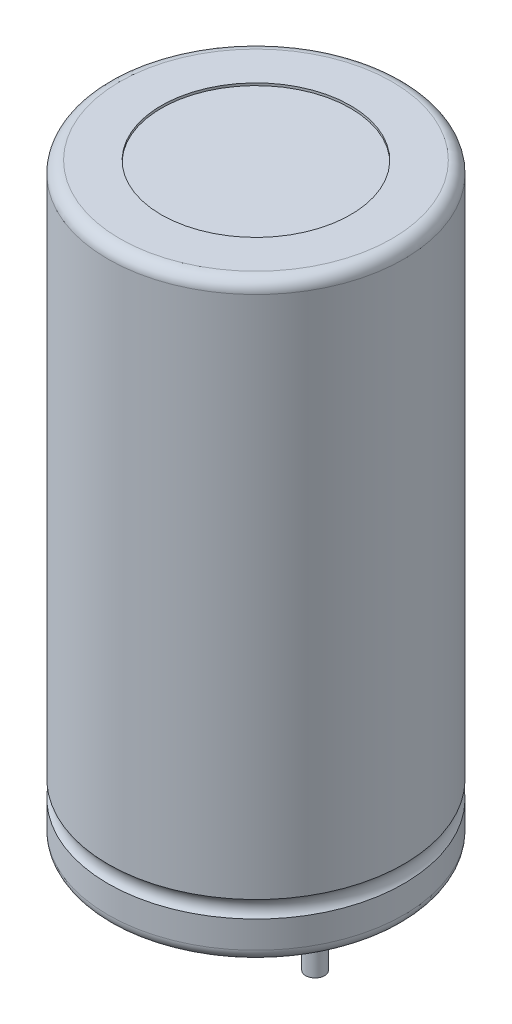
ISO-10303-21;
HEADER;
FILE_DESCRIPTION(('STEP AP214'),'2;1');
FILE_NAME('part.step','',(''),(''),'','','');
FILE_SCHEMA(('AUTOMOTIVE_DESIGN { 1 0 10303 214 1 1 1 1 }'));
ENDSEC;
DATA;
#1=APPLICATION_CONTEXT('core data for automotive mechanical design processes');
#2=APPLICATION_PROTOCOL_DEFINITION('international standard','automotive_design',2000,#1);
#3=PRODUCT_CONTEXT('',#1,'mechanical');
#4=PRODUCT('Part','Part','',(#3));
#5=PRODUCT_RELATED_PRODUCT_CATEGORY('part','',(#4));
#6=PRODUCT_DEFINITION_FORMATION('','',#4);
#7=PRODUCT_DEFINITION_CONTEXT('part definition',#1,'design');
#8=PRODUCT_DEFINITION('design','',#6,#7);
#9=PRODUCT_DEFINITION_SHAPE('','',#8);
#10=(LENGTH_UNIT() NAMED_UNIT(*) SI_UNIT(.MILLI.,.METRE.));
#11=(NAMED_UNIT(*) PLANE_ANGLE_UNIT() SI_UNIT($,.RADIAN.));
#12=(NAMED_UNIT(*) SI_UNIT($,.STERADIAN.) SOLID_ANGLE_UNIT());
#13=UNCERTAINTY_MEASURE_WITH_UNIT(LENGTH_MEASURE(1.E-05),#10,'distance_accuracy_value','');
#14=(GEOMETRIC_REPRESENTATION_CONTEXT(3) GLOBAL_UNCERTAINTY_ASSIGNED_CONTEXT((#13)) GLOBAL_UNIT_ASSIGNED_CONTEXT((#10,
#11,#12)) REPRESENTATION_CONTEXT('',''));
#15=CARTESIAN_POINT('',(0.,0.,0.));
#16=DIRECTION('',(0.,0.,1.));
#17=DIRECTION('',(1.,0.,0.));
#18=AXIS2_PLACEMENT_3D('',#15,#16,#17);
#19=CARTESIAN_POINT('',(2.5,-3.4,0.));
#20=DIRECTION('',(0.,-1.,0.));
#21=DIRECTION('',(0.,0.,-1.));
#22=AXIS2_PLACEMENT_3D('',#19,#20,#21);
#23=PLANE('',#22);
#24=CARTESIAN_POINT('',(2.5,-3.4,0.));
#25=DIRECTION('',(0.,1.,0.));
#26=DIRECTION('',(0.,0.,1.));
#27=AXIS2_PLACEMENT_3D('',#24,#25,#26);
#28=CIRCLE('',#27,0.4);
#29=CARTESIAN_POINT('',(2.5,-3.4,0.4));
#30=VERTEX_POINT('',#29);
#31=EDGE_CURVE('E188',#30,#30,#28,.T.);
#32=ORIENTED_EDGE('',*,*,#31,.F.);
#33=EDGE_LOOP('',(#32));
#34=FACE_BOUND('',#33,.T.);
#35=ADVANCED_FACE('F17',(#34),#23,.T.);
#36=CARTESIAN_POINT('',(-2.5,-3.4,0.));
#37=DIRECTION('',(0.,-1.,0.));
#38=DIRECTION('',(0.,0.,-1.));
#39=AXIS2_PLACEMENT_3D('',#36,#37,#38);
#40=PLANE('',#39);
#41=CARTESIAN_POINT('',(-2.5,-3.4,0.));
#42=DIRECTION('',(0.,1.,0.));
#43=DIRECTION('',(0.,0.,1.));
#44=AXIS2_PLACEMENT_3D('',#41,#42,#43);
#45=CIRCLE('',#44,0.4);
#46=CARTESIAN_POINT('',(-2.5,-3.4,0.4));
#47=VERTEX_POINT('',#46);
#48=EDGE_CURVE('E185',#47,#47,#45,.T.);
#49=ORIENTED_EDGE('',*,*,#48,.F.);
#50=EDGE_LOOP('',(#49));
#51=FACE_BOUND('',#50,.T.);
#52=ADVANCED_FACE('F203',(#51),#40,.T.);
#53=CARTESIAN_POINT('',(2.5,-3.4,0.));
#54=DIRECTION('',(0.,1.,0.));
#55=DIRECTION('',(0.,0.,1.));
#56=AXIS2_PLACEMENT_3D('',#53,#54,#55);
#57=CYLINDRICAL_SURFACE('',#56,0.4);
#58=CARTESIAN_POINT('',(2.5,0.0999999999999998,0.));
#59=DIRECTION('',(0.,1.,0.));
#60=DIRECTION('',(0.,0.,1.));
#61=AXIS2_PLACEMENT_3D('',#58,#59,#60);
#62=CIRCLE('',#61,0.4);
#63=CARTESIAN_POINT('',(2.5,0.0999999999999998,0.4));
#64=VERTEX_POINT('',#63);
#65=EDGE_CURVE('E182',#64,#64,#62,.T.);
#66=ORIENTED_EDGE('',*,*,#65,.F.);
#67=EDGE_LOOP('',(#66));
#68=FACE_BOUND('',#67,.T.);
#69=ORIENTED_EDGE('',*,*,#31,.T.);
#70=EDGE_LOOP('',(#69));
#71=FACE_BOUND('',#70,.T.);
#72=ADVANCED_FACE('F200',(#68,#71),#57,.T.);
#73=CARTESIAN_POINT('',(-2.5,-3.4,0.));
#74=DIRECTION('',(0.,1.,0.));
#75=DIRECTION('',(0.,0.,1.));
#76=AXIS2_PLACEMENT_3D('',#73,#74,#75);
#77=CYLINDRICAL_SURFACE('',#76,0.4);
#78=CARTESIAN_POINT('',(-2.5,0.0999999999999998,0.));
#79=DIRECTION('',(0.,1.,0.));
#80=DIRECTION('',(0.,0.,1.));
#81=AXIS2_PLACEMENT_3D('',#78,#79,#80);
#82=CIRCLE('',#81,0.4);
#83=CARTESIAN_POINT('',(-2.5,0.0999999999999998,0.4));
#84=VERTEX_POINT('',#83);
#85=EDGE_CURVE('E179',#84,#84,#82,.T.);
#86=ORIENTED_EDGE('',*,*,#85,.F.);
#87=EDGE_LOOP('',(#86));
#88=FACE_BOUND('',#87,.T.);
#89=ORIENTED_EDGE('',*,*,#48,.T.);
#90=EDGE_LOOP('',(#89));
#91=FACE_BOUND('',#90,.T.);
#92=ADVANCED_FACE('F211',(#88,#91),#77,.T.);
#93=CARTESIAN_POINT('',(-4.,0.1,0.));
#94=DIRECTION('',(0.,-1.,0.));
#95=DIRECTION('',(0.,0.,-1.));
#96=AXIS2_PLACEMENT_3D('',#93,#94,#95);
#97=PLANE('',#96);
#98=CARTESIAN_POINT('',(0.,0.100000000000003,0.));
#99=DIRECTION('',(0.,1.,0.));
#100=DIRECTION('',(0.,0.,1.));
#101=AXIS2_PLACEMENT_3D('',#98,#99,#100);
#102=CIRCLE('',#101,4.);
#103=CARTESIAN_POINT('',(0.,0.100000000000003,4.));
#104=VERTEX_POINT('',#103);
#105=EDGE_CURVE('E176',#104,#104,#102,.F.);
#106=ORIENTED_EDGE('',*,*,#105,.T.);
#107=EDGE_LOOP('',(#106));
#108=FACE_BOUND('',#107,.T.);
#109=ORIENTED_EDGE('',*,*,#85,.T.);
#110=EDGE_LOOP('',(#109));
#111=FACE_BOUND('',#110,.T.);
#112=ORIENTED_EDGE('',*,*,#65,.T.);
#113=EDGE_LOOP('',(#112));
#114=FACE_BOUND('',#113,.T.);
#115=ADVANCED_FACE('F218',(#108,#111,#114),#97,.T.);
#116=CARTESIAN_POINT('',(0.,42.5565122190237,0.));
#117=DIRECTION('',(0.,1.,0.));
#118=DIRECTION('',(0.,0.,1.));
#119=AXIS2_PLACEMENT_3D('',#116,#117,#118);
#120=CYLINDRICAL_SURFACE('',#119,4.);
#121=ORIENTED_EDGE('',*,*,#105,.F.);
#122=EDGE_LOOP('',(#121));
#123=FACE_BOUND('',#122,.T.);
#124=CARTESIAN_POINT('',(0.,0.,0.));
#125=DIRECTION('',(0.,1.,0.));
#126=DIRECTION('',(0.,0.,1.));
#127=AXIS2_PLACEMENT_3D('',#124,#125,#126);
#128=CIRCLE('',#127,4.);
#129=CARTESIAN_POINT('',(0.,0.,4.));
#130=VERTEX_POINT('',#129);
#131=EDGE_CURVE('E53',#130,#130,#128,.T.);
#132=ORIENTED_EDGE('',*,*,#131,.F.);
#133=EDGE_LOOP('',(#132));
#134=FACE_BOUND('',#133,.T.);
#135=ADVANCED_FACE('F221',(#123,#134),#120,.F.);
#136=CARTESIAN_POINT('',(-4.,0.,0.));
#137=DIRECTION('',(0.,-1.,0.));
#138=DIRECTION('',(0.,0.,-1.));
#139=AXIS2_PLACEMENT_3D('',#136,#137,#138);
#140=PLANE('',#139);
#141=CARTESIAN_POINT('',(0.,0.,0.));
#142=DIRECTION('',(0.,1.,0.));
#143=DIRECTION('',(0.,0.,1.));
#144=AXIS2_PLACEMENT_3D('',#141,#142,#143);
#145=CIRCLE('',#144,5.75);
#146=CARTESIAN_POINT('',(0.,0.,5.74999999999999));
#147=VERTEX_POINT('',#146);
#148=CARTESIAN_POINT('',(0.,0.,-5.74999999999999));
#149=VERTEX_POINT('',#148);
#150=EDGE_CURVE('E45',#147,#149,#145,.T.);
#151=ORIENTED_EDGE('',*,*,#150,.F.);
#152=CARTESIAN_POINT('',(0.,0.,0.));
#153=DIRECTION('',(0.,1.,0.));
#154=DIRECTION('',(0.,0.,-1.));
#155=AXIS2_PLACEMENT_3D('',#152,#153,#154);
#156=CIRCLE('',#155,5.75);
#157=EDGE_CURVE('E48',#149,#147,#156,.T.);
#158=ORIENTED_EDGE('',*,*,#157,.F.);
#159=EDGE_LOOP('',(#151,#158));
#160=FACE_BOUND('',#159,.T.);
#161=ORIENTED_EDGE('',*,*,#131,.T.);
#162=EDGE_LOOP('',(#161));
#163=FACE_BOUND('',#162,.T.);
#164=ADVANCED_FACE('F50',(#160,#163),#140,.T.);
#165=CARTESIAN_POINT('',(0.,0.5,0.));
#166=DIRECTION('',(0.,1.,0.));
#167=DIRECTION('',(0.,0.,1.));
#168=AXIS2_PLACEMENT_3D('',#165,#166,#167);
#169=TOROIDAL_SURFACE('',#168,5.74999999999999,0.5);
#170=CARTESIAN_POINT('',(0.,0.5,0.));
#171=DIRECTION('',(0.,1.,0.));
#172=DIRECTION('',(0.,0.,1.));
#173=AXIS2_PLACEMENT_3D('',#170,#171,#172);
#174=CIRCLE('',#173,6.25);
#175=CARTESIAN_POINT('',(0.,0.5,6.25));
#176=VERTEX_POINT('',#175);
#177=EDGE_CURVE('E58',#176,#176,#174,.T.);
#178=ORIENTED_EDGE('',*,*,#177,.F.);
#179=EDGE_LOOP('',(#178));
#180=FACE_BOUND('',#179,.T.);
#181=ORIENTED_EDGE('',*,*,#150,.T.);
#182=ORIENTED_EDGE('',*,*,#157,.T.);
#183=EDGE_LOOP('',(#181,#182));
#184=FACE_BOUND('',#183,.T.);
#185=ADVANCED_FACE('F57',(#180,#184),#169,.T.);
#186=CARTESIAN_POINT('',(-4.,24.9,0.));
#187=DIRECTION('',(0.,1.,0.));
#188=DIRECTION('',(0.,0.,1.));
#189=AXIS2_PLACEMENT_3D('',#186,#187,#188);
#190=PLANE('',#189);
#191=CARTESIAN_POINT('',(0.,24.9,0.));
#192=DIRECTION('',(0.,1.,0.));
#193=DIRECTION('',(0.,0.,1.));
#194=AXIS2_PLACEMENT_3D('',#191,#192,#193);
#195=CIRCLE('',#194,4.);
#196=CARTESIAN_POINT('',(0.,24.9,4.));
#197=VERTEX_POINT('',#196);
#198=EDGE_CURVE('E94',#197,#197,#195,.T.);
#199=ORIENTED_EDGE('',*,*,#198,.T.);
#200=EDGE_LOOP('',(#199));
#201=FACE_BOUND('',#200,.T.);
#202=ADVANCED_FACE('F77',(#201),#190,.T.);
#203=CARTESIAN_POINT('',(0.,42.5565122190237,0.));
#204=DIRECTION('',(0.,1.,0.));
#205=DIRECTION('',(0.,0.,1.));
#206=AXIS2_PLACEMENT_3D('',#203,#204,#205);
#207=CYLINDRICAL_SURFACE('',#206,6.25);
#208=CARTESIAN_POINT('',(0.,1.64292857857286,0.));
#209=DIRECTION('',(0.,1.,0.));
#210=DIRECTION('',(0.,0.,1.));
#211=AXIS2_PLACEMENT_3D('',#208,#209,#210);
#212=CIRCLE('',#211,6.25);
#213=CARTESIAN_POINT('',(0.,1.64292857857286,6.25));
#214=VERTEX_POINT('',#213);
#215=EDGE_CURVE('E95',#214,#214,#212,.F.);
#216=ORIENTED_EDGE('',*,*,#215,.T.);
#217=EDGE_LOOP('',(#216));
#218=FACE_BOUND('',#217,.T.);
#219=ORIENTED_EDGE('',*,*,#177,.T.);
#220=EDGE_LOOP('',(#219));
#221=FACE_BOUND('',#220,.T.);
#222=ADVANCED_FACE('F148',(#218,#221),#207,.T.);
#223=CARTESIAN_POINT('',(0.,42.5565122190237,0.));
#224=DIRECTION('',(0.,1.,0.));
#225=DIRECTION('',(0.,0.,1.));
#226=AXIS2_PLACEMENT_3D('',#223,#224,#225);
#227=CYLINDRICAL_SURFACE('',#226,4.);
#228=CARTESIAN_POINT('',(0.,25.,0.));
#229=DIRECTION('',(0.,1.,0.));
#230=DIRECTION('',(0.,0.,1.));
#231=AXIS2_PLACEMENT_3D('',#228,#229,#230);
#232=CIRCLE('',#231,4.);
#233=CARTESIAN_POINT('',(0.,25.,4.));
#234=VERTEX_POINT('',#233);
#235=EDGE_CURVE('E66',#234,#234,#232,.F.);
#236=ORIENTED_EDGE('',*,*,#235,.F.);
#237=EDGE_LOOP('',(#236));
#238=FACE_BOUND('',#237,.T.);
#239=ORIENTED_EDGE('',*,*,#198,.F.);
#240=EDGE_LOOP('',(#239));
#241=FACE_BOUND('',#240,.T.);
#242=ADVANCED_FACE('F137',(#238,#241),#227,.F.);
#243=CARTESIAN_POINT('',(-5.74999999999999,25.,0.));
#244=DIRECTION('',(0.,1.,0.));
#245=DIRECTION('',(0.,0.,1.));
#246=AXIS2_PLACEMENT_3D('',#243,#244,#245);
#247=PLANE('',#246);
#248=ORIENTED_EDGE('',*,*,#235,.T.);
#249=EDGE_LOOP('',(#248));
#250=FACE_BOUND('',#249,.T.);
#251=CARTESIAN_POINT('',(0.,25.,0.));
#252=DIRECTION('',(0.,-1.,0.));
#253=DIRECTION('',(0.,0.,-1.));
#254=AXIS2_PLACEMENT_3D('',#251,#252,#253);
#255=CIRCLE('',#254,5.75);
#256=CARTESIAN_POINT('',(0.,25.,-5.74999999999999));
#257=VERTEX_POINT('',#256);
#258=CARTESIAN_POINT('',(0.,25.,5.74999999999999));
#259=VERTEX_POINT('',#258);
#260=EDGE_CURVE('E125',#257,#259,#255,.T.);
#261=ORIENTED_EDGE('',*,*,#260,.F.);
#262=CARTESIAN_POINT('',(0.,25.,0.));
#263=DIRECTION('',(0.,-1.,0.));
#264=DIRECTION('',(0.,0.,1.));
#265=AXIS2_PLACEMENT_3D('',#262,#263,#264);
#266=CIRCLE('',#265,5.75);
#267=EDGE_CURVE('E36',#259,#257,#266,.T.);
#268=ORIENTED_EDGE('',*,*,#267,.F.);
#269=EDGE_LOOP('',(#261,#268));
#270=FACE_BOUND('',#269,.T.);
#271=ADVANCED_FACE('F128',(#250,#270),#247,.T.);
#272=CARTESIAN_POINT('',(0.,2.,0.));
#273=DIRECTION('',(0.,1.,0.));
#274=DIRECTION('',(0.,0.,1.));
#275=AXIS2_PLACEMENT_3D('',#272,#273,#274);
#276=TOROIDAL_SURFACE('',#275,6.6,0.5);
#277=ORIENTED_EDGE('',*,*,#215,.F.);
#278=EDGE_LOOP('',(#277));
#279=FACE_BOUND('',#278,.T.);
#280=CARTESIAN_POINT('',(0.,2.35707142142714,0.));
#281=DIRECTION('',(0.,1.,0.));
#282=DIRECTION('',(0.,0.,1.));
#283=AXIS2_PLACEMENT_3D('',#280,#281,#282);
#284=CIRCLE('',#283,6.25);
#285=CARTESIAN_POINT('',(0.,2.35707142142714,6.25));
#286=VERTEX_POINT('',#285);
#287=EDGE_CURVE('E28',#286,#286,#284,.T.);
#288=ORIENTED_EDGE('',*,*,#287,.F.);
#289=EDGE_LOOP('',(#288));
#290=FACE_BOUND('',#289,.T.);
#291=ADVANCED_FACE('F115',(#279,#290),#276,.F.);
#292=CARTESIAN_POINT('',(0.,24.5,0.));
#293=DIRECTION('',(0.,1.,0.));
#294=DIRECTION('',(0.,0.,1.));
#295=AXIS2_PLACEMENT_3D('',#292,#293,#294);
#296=TOROIDAL_SURFACE('',#295,5.74999999999999,0.5);
#297=ORIENTED_EDGE('',*,*,#267,.T.);
#298=ORIENTED_EDGE('',*,*,#260,.T.);
#299=EDGE_LOOP('',(#297,#298));
#300=FACE_BOUND('',#299,.T.);
#301=CARTESIAN_POINT('',(0.,24.5,0.));
#302=DIRECTION('',(0.,1.,0.));
#303=DIRECTION('',(0.,0.,1.));
#304=AXIS2_PLACEMENT_3D('',#301,#302,#303);
#305=CIRCLE('',#304,6.25);
#306=CARTESIAN_POINT('',(0.,24.5,6.25));
#307=VERTEX_POINT('',#306);
#308=EDGE_CURVE('E11',#307,#307,#305,.F.);
#309=ORIENTED_EDGE('',*,*,#308,.F.);
#310=EDGE_LOOP('',(#309));
#311=FACE_BOUND('',#310,.T.);
#312=ADVANCED_FACE('F103',(#300,#311),#296,.T.);
#313=CARTESIAN_POINT('',(0.,42.5565122190237,0.));
#314=DIRECTION('',(0.,1.,0.));
#315=DIRECTION('',(0.,0.,1.));
#316=AXIS2_PLACEMENT_3D('',#313,#314,#315);
#317=CYLINDRICAL_SURFACE('',#316,6.25);
#318=ORIENTED_EDGE('',*,*,#308,.T.);
#319=EDGE_LOOP('',(#318));
#320=FACE_BOUND('',#319,.T.);
#321=ORIENTED_EDGE('',*,*,#287,.T.);
#322=EDGE_LOOP('',(#321));
#323=FACE_BOUND('',#322,.T.);
#324=ADVANCED_FACE('F114',(#320,#323),#317,.T.);
#325=CLOSED_SHELL('',(#35,#52,#72,#92,#115,#135,#164,#185,#202,#222,#242,#271,#291,#312,#324));
#326=MANIFOLD_SOLID_BREP('B1',#325);
#327=ADVANCED_BREP_SHAPE_REPRESENTATION('',(#18,#326),#14);
#328=SHAPE_DEFINITION_REPRESENTATION(#9,#327);
ENDSEC;
END-ISO-10303-21;
